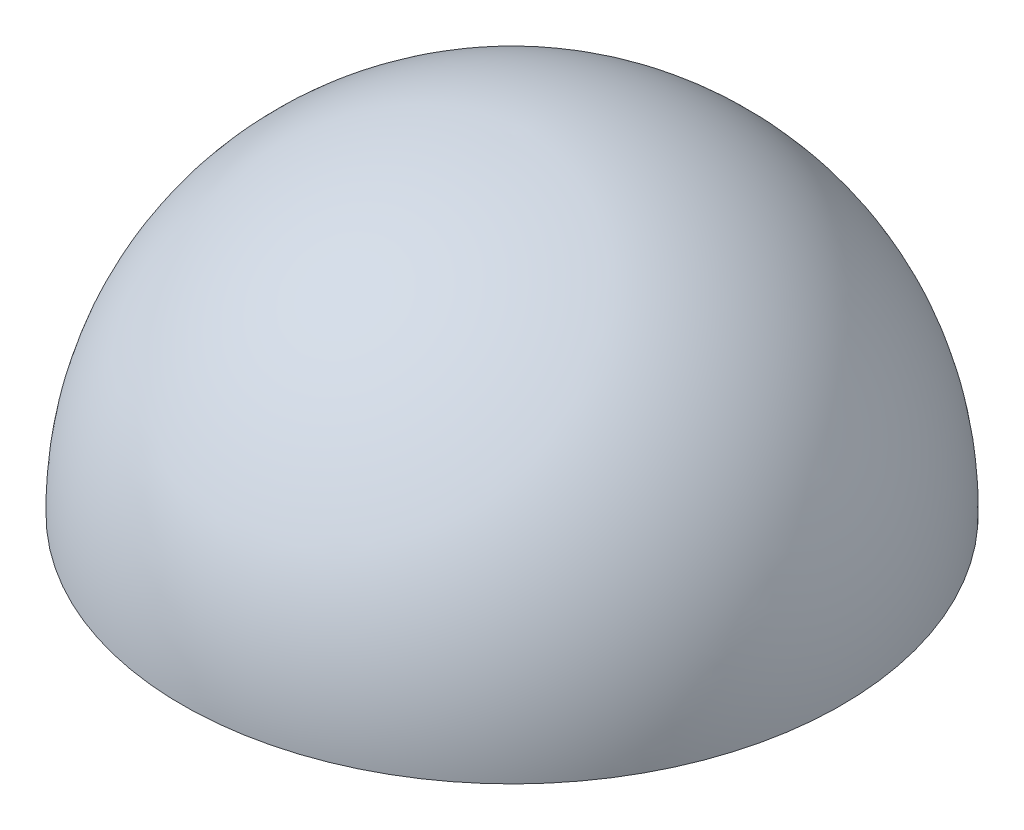
ISO-10303-21;
HEADER;
FILE_DESCRIPTION(('STEP AP214'),'2;1');
FILE_NAME('part.step','',(''),(''),'','','');
FILE_SCHEMA(('AUTOMOTIVE_DESIGN { 1 0 10303 214 1 1 1 1 }'));
ENDSEC;
DATA;
#1=APPLICATION_CONTEXT('core data for automotive mechanical design processes');
#2=APPLICATION_PROTOCOL_DEFINITION('international standard','automotive_design',2000,#1);
#3=PRODUCT_CONTEXT('',#1,'mechanical');
#4=PRODUCT('Part','Part','',(#3));
#5=PRODUCT_RELATED_PRODUCT_CATEGORY('part','',(#4));
#6=PRODUCT_DEFINITION_FORMATION('','',#4);
#7=PRODUCT_DEFINITION_CONTEXT('part definition',#1,'design');
#8=PRODUCT_DEFINITION('design','',#6,#7);
#9=PRODUCT_DEFINITION_SHAPE('','',#8);
#10=(LENGTH_UNIT() NAMED_UNIT(*) SI_UNIT(.MILLI.,.METRE.));
#11=(NAMED_UNIT(*) PLANE_ANGLE_UNIT() SI_UNIT($,.RADIAN.));
#12=(NAMED_UNIT(*) SI_UNIT($,.STERADIAN.) SOLID_ANGLE_UNIT());
#13=UNCERTAINTY_MEASURE_WITH_UNIT(LENGTH_MEASURE(1.E-05),#10,'distance_accuracy_value','');
#14=(GEOMETRIC_REPRESENTATION_CONTEXT(3) GLOBAL_UNCERTAINTY_ASSIGNED_CONTEXT((#13)) GLOBAL_UNIT_ASSIGNED_CONTEXT((#10,
#11,#12)) REPRESENTATION_CONTEXT('',''));
#15=CARTESIAN_POINT('',(0.,0.,0.));
#16=DIRECTION('',(0.,0.,1.));
#17=DIRECTION('',(1.,0.,0.));
#18=AXIS2_PLACEMENT_3D('',#15,#16,#17);
#19=CARTESIAN_POINT('',(0.,0.,0.));
#20=DIRECTION('',(0.,-1.,0.));
#21=DIRECTION('',(0.,0.,-1.));
#22=AXIS2_PLACEMENT_3D('',#19,#20,#21);
#23=PLANE('',#22);
#24=CARTESIAN_POINT('',(0.,0.,0.));
#25=DIRECTION('',(0.,-1.,0.));
#26=DIRECTION('',(0.,0.,-1.));
#27=AXIS2_PLACEMENT_3D('',#24,#25,#26);
#28=CIRCLE('',#27,4.);
#29=CARTESIAN_POINT('',(0.,0.,-4.));
#30=VERTEX_POINT('',#29);
#31=EDGE_CURVE('E11',#30,#30,#28,.T.);
#32=ORIENTED_EDGE('',*,*,#31,.T.);
#33=EDGE_LOOP('',(#32));
#34=FACE_BOUND('',#33,.T.);
#35=ADVANCED_FACE('F33',(#34),#23,.T.);
#36=CARTESIAN_POINT('',(0.,0.0591630591630207,-0.0591630591630207));
#37=DIRECTION('',(-1.,0.,0.));
#38=DIRECTION('',(0.,0.,-1.));
#39=AXIS2_PLACEMENT_3D('',#36,#37,#38);
#40=CIRCLE('',#39,3.94128101787159);
#41=TRIMMED_CURVE('',#40,(PARAMETER_VALUE(-1.58580801487975)),
(PARAMETER_VALUE(1.58580801487975)),.T.,.PARAMETER.);
#42=CARTESIAN_POINT('',(0.,0.0591630591630207,0.));
#43=DIRECTION('',(0.,-1.,0.));
#44=AXIS1_PLACEMENT('',#42,#43);
#45=SURFACE_OF_REVOLUTION('',#41,#44);
#46=CARTESIAN_POINT('',(0.,4.,0.));
#47=VERTEX_POINT('',#46);
#48=VERTEX_LOOP('',#47);
#49=FACE_BOUND('',#48,.T.);
#50=ORIENTED_EDGE('',*,*,#31,.F.);
#51=EDGE_LOOP('',(#50));
#52=FACE_BOUND('',#51,.T.);
#53=ADVANCED_FACE('F40',(#49,#52),#45,.T.);
#54=CLOSED_SHELL('',(#35,#53));
#55=MANIFOLD_SOLID_BREP('B2',#54);
#56=ADVANCED_BREP_SHAPE_REPRESENTATION('',(#18,#55),#14);
#57=SHAPE_DEFINITION_REPRESENTATION(#9,#56);
ENDSEC;
END-ISO-10303-21;
